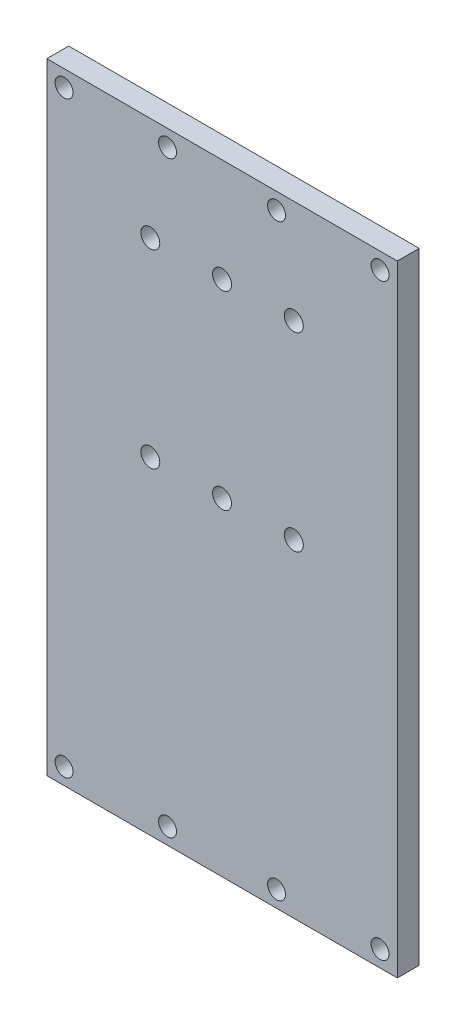
ISO-10303-21;
HEADER;
FILE_DESCRIPTION(('STEP AP214'),'2;1');
FILE_NAME('part.step','',(''),(''),'','','');
FILE_SCHEMA(('AUTOMOTIVE_DESIGN { 1 0 10303 214 1 1 1 1 }'));
ENDSEC;
DATA;
#1=APPLICATION_CONTEXT('core data for automotive mechanical design processes');
#2=APPLICATION_PROTOCOL_DEFINITION('international standard','automotive_design',2000,#1);
#3=PRODUCT_CONTEXT('',#1,'mechanical');
#4=PRODUCT('Part','Part','',(#3));
#5=PRODUCT_RELATED_PRODUCT_CATEGORY('part','',(#4));
#6=PRODUCT_DEFINITION_FORMATION('','',#4);
#7=PRODUCT_DEFINITION_CONTEXT('part definition',#1,'design');
#8=PRODUCT_DEFINITION('design','',#6,#7);
#9=PRODUCT_DEFINITION_SHAPE('','',#8);
#10=(LENGTH_UNIT() NAMED_UNIT(*) SI_UNIT(.MILLI.,.METRE.));
#11=(NAMED_UNIT(*) PLANE_ANGLE_UNIT() SI_UNIT($,.RADIAN.));
#12=(NAMED_UNIT(*) SI_UNIT($,.STERADIAN.) SOLID_ANGLE_UNIT());
#13=UNCERTAINTY_MEASURE_WITH_UNIT(LENGTH_MEASURE(1.E-05),#10,'distance_accuracy_value','');
#14=(GEOMETRIC_REPRESENTATION_CONTEXT(3) GLOBAL_UNCERTAINTY_ASSIGNED_CONTEXT((#13)) GLOBAL_UNIT_ASSIGNED_CONTEXT((#10,
#11,#12)) REPRESENTATION_CONTEXT('',''));
#15=CARTESIAN_POINT('',(0.,0.,0.));
#16=DIRECTION('',(0.,0.,1.));
#17=DIRECTION('',(1.,0.,0.));
#18=AXIS2_PLACEMENT_3D('',#15,#16,#17);
#19=CARTESIAN_POINT('',(-50.8,90.,6.35));
#20=DIRECTION('',(1.,0.,0.));
#21=DIRECTION('',(0.,1.,0.));
#22=AXIS2_PLACEMENT_3D('',#19,#20,#21);
#23=PLANE('',#22);
#24=DIRECTION('',(0.,-1.,0.));
#25=VECTOR('',#24,1.);
#26=CARTESIAN_POINT('',(-50.8,90.,0.));
#27=LINE('',#26,#25);
#28=CARTESIAN_POINT('',(-50.8,90.,0.));
#29=VERTEX_POINT('',#28);
#30=CARTESIAN_POINT('',(-50.8,-90.,0.));
#31=VERTEX_POINT('',#30);
#32=EDGE_CURVE('E95',#29,#31,#27,.T.);
#33=ORIENTED_EDGE('',*,*,#32,.T.);
#34=DIRECTION('',(0.,0.,-1.));
#35=VECTOR('',#34,1.);
#36=CARTESIAN_POINT('',(-50.8,-90.,6.35));
#37=LINE('',#36,#35);
#38=CARTESIAN_POINT('',(-50.8,-90.,6.35));
#39=VERTEX_POINT('',#38);
#40=EDGE_CURVE('E11',#39,#31,#37,.T.);
#41=ORIENTED_EDGE('',*,*,#40,.F.);
#42=DIRECTION('',(0.,-1.,0.));
#43=VECTOR('',#42,1.);
#44=CARTESIAN_POINT('',(-50.8,90.,6.35));
#45=LINE('',#44,#43);
#46=CARTESIAN_POINT('',(-50.8,90.,6.35));
#47=VERTEX_POINT('',#46);
#48=EDGE_CURVE('E83',#47,#39,#45,.T.);
#49=ORIENTED_EDGE('',*,*,#48,.F.);
#50=DIRECTION('',(0.,0.,-1.));
#51=VECTOR('',#50,1.);
#52=CARTESIAN_POINT('',(-50.8,90.,6.35));
#53=LINE('',#52,#51);
#54=EDGE_CURVE('E91',#47,#29,#53,.T.);
#55=ORIENTED_EDGE('',*,*,#54,.T.);
#56=EDGE_LOOP('',(#33,#41,#49,#55));
#57=FACE_BOUND('',#56,.T.);
#58=ADVANCED_FACE('F32',(#57),#23,.F.);
#59=CARTESIAN_POINT('',(-50.8,-90.,6.35));
#60=DIRECTION('',(0.,1.,0.));
#61=DIRECTION('',(0.,0.,1.));
#62=AXIS2_PLACEMENT_3D('',#59,#60,#61);
#63=PLANE('',#62);
#64=DIRECTION('',(1.,0.,0.));
#65=VECTOR('',#64,1.);
#66=CARTESIAN_POINT('',(-50.8,-90.,0.));
#67=LINE('',#66,#65);
#68=CARTESIAN_POINT('',(50.8,-90.,0.));
#69=VERTEX_POINT('',#68);
#70=EDGE_CURVE('E87',#31,#69,#67,.T.);
#71=ORIENTED_EDGE('',*,*,#70,.T.);
#72=DIRECTION('',(0.,0.,-1.));
#73=VECTOR('',#72,1.);
#74=CARTESIAN_POINT('',(50.8,-90.,6.35));
#75=LINE('',#74,#73);
#76=CARTESIAN_POINT('',(50.8,-90.,6.35));
#77=VERTEX_POINT('',#76);
#78=EDGE_CURVE('E40',#77,#69,#75,.T.);
#79=ORIENTED_EDGE('',*,*,#78,.F.);
#80=DIRECTION('',(1.,0.,0.));
#81=VECTOR('',#80,1.);
#82=CARTESIAN_POINT('',(-50.8,-90.,6.35));
#83=LINE('',#82,#81);
#84=EDGE_CURVE('E78',#39,#77,#83,.T.);
#85=ORIENTED_EDGE('',*,*,#84,.F.);
#86=ORIENTED_EDGE('',*,*,#40,.T.);
#87=EDGE_LOOP('',(#71,#79,#85,#86));
#88=FACE_BOUND('',#87,.T.);
#89=ADVANCED_FACE('F86',(#88),#63,.F.);
#90=CARTESIAN_POINT('',(50.8,90.,6.35));
#91=DIRECTION('',(-1.,0.,0.));
#92=DIRECTION('',(0.,-1.,0.));
#93=AXIS2_PLACEMENT_3D('',#90,#91,#92);
#94=PLANE('',#93);
#95=DIRECTION('',(0.,1.,0.));
#96=VECTOR('',#95,1.);
#97=CARTESIAN_POINT('',(50.8,90.,0.));
#98=LINE('',#97,#96);
#99=CARTESIAN_POINT('',(50.8,90.,0.));
#100=VERTEX_POINT('',#99);
#101=EDGE_CURVE('E65',#69,#100,#98,.T.);
#102=ORIENTED_EDGE('',*,*,#101,.T.);
#103=DIRECTION('',(0.,0.,-1.));
#104=VECTOR('',#103,1.);
#105=CARTESIAN_POINT('',(50.8,90.,6.35));
#106=LINE('',#105,#104);
#107=CARTESIAN_POINT('',(50.8,90.,6.35));
#108=VERTEX_POINT('',#107);
#109=EDGE_CURVE('E88',#108,#100,#106,.T.);
#110=ORIENTED_EDGE('',*,*,#109,.F.);
#111=DIRECTION('',(0.,1.,0.));
#112=VECTOR('',#111,1.);
#113=CARTESIAN_POINT('',(50.8,90.,6.35));
#114=LINE('',#113,#112);
#115=EDGE_CURVE('E81',#77,#108,#114,.T.);
#116=ORIENTED_EDGE('',*,*,#115,.F.);
#117=ORIENTED_EDGE('',*,*,#78,.T.);
#118=EDGE_LOOP('',(#102,#110,#116,#117));
#119=FACE_BOUND('',#118,.T.);
#120=ADVANCED_FACE('F89',(#119),#94,.F.);
#121=CARTESIAN_POINT('',(-50.8,90.,6.35));
#122=DIRECTION('',(0.,-1.,0.));
#123=DIRECTION('',(0.,0.,-1.));
#124=AXIS2_PLACEMENT_3D('',#121,#122,#123);
#125=PLANE('',#124);
#126=DIRECTION('',(-1.,0.,0.));
#127=VECTOR('',#126,1.);
#128=CARTESIAN_POINT('',(-50.8,90.,0.));
#129=LINE('',#128,#127);
#130=EDGE_CURVE('E71',#100,#29,#129,.T.);
#131=ORIENTED_EDGE('',*,*,#130,.T.);
#132=ORIENTED_EDGE('',*,*,#54,.F.);
#133=DIRECTION('',(-1.,0.,0.));
#134=VECTOR('',#133,1.);
#135=CARTESIAN_POINT('',(-50.8,90.,6.35));
#136=LINE('',#135,#134);
#137=EDGE_CURVE('E48',#108,#47,#136,.T.);
#138=ORIENTED_EDGE('',*,*,#137,.F.);
#139=ORIENTED_EDGE('',*,*,#109,.T.);
#140=EDGE_LOOP('',(#131,#132,#138,#139));
#141=FACE_BOUND('',#140,.T.);
#142=ADVANCED_FACE('F103',(#141),#125,.F.);
#143=CARTESIAN_POINT('',(-50.8,-90.,6.35));
#144=DIRECTION('',(0.,0.,1.));
#145=DIRECTION('',(1.,0.,0.));
#146=AXIS2_PLACEMENT_3D('',#143,#144,#145);
#147=PLANE('',#146);
#148=CARTESIAN_POINT('',(-20.8,5.00000000000001,6.35));
#149=DIRECTION('',(0.,0.,1.));
#150=DIRECTION('',(1.,0.,0.));
#151=AXIS2_PLACEMENT_3D('',#148,#149,#150);
#152=CIRCLE('',#151,2.74999999999996);
#153=CARTESIAN_POINT('',(-18.05,5.00000000000001,6.35));
#154=VERTEX_POINT('',#153);
#155=EDGE_CURVE('E189',#154,#154,#152,.T.);
#156=ORIENTED_EDGE('',*,*,#155,.F.);
#157=EDGE_LOOP('',(#156));
#158=FACE_BOUND('',#157,.T.);
#159=CARTESIAN_POINT('',(0.,5.00000000000001,6.35));
#160=DIRECTION('',(0.,0.,1.));
#161=DIRECTION('',(-1.,0.,0.));
#162=AXIS2_PLACEMENT_3D('',#159,#160,#161);
#163=CIRCLE('',#162,2.75);
#164=CARTESIAN_POINT('',(-2.74999999999997,5.00000000000001,6.35));
#165=VERTEX_POINT('',#164);
#166=EDGE_CURVE('E183',#165,#165,#163,.T.);
#167=ORIENTED_EDGE('',*,*,#166,.F.);
#168=EDGE_LOOP('',(#167));
#169=FACE_BOUND('',#168,.T.);
#170=CARTESIAN_POINT('',(20.8,5.00000000000001,6.35));
#171=DIRECTION('',(0.,0.,1.));
#172=DIRECTION('',(-1.,0.,0.));
#173=AXIS2_PLACEMENT_3D('',#170,#171,#172);
#174=CIRCLE('',#173,2.75);
#175=CARTESIAN_POINT('',(18.05,5.00000000000001,6.35));
#176=VERTEX_POINT('',#175);
#177=EDGE_CURVE('E177',#176,#176,#174,.T.);
#178=ORIENTED_EDGE('',*,*,#177,.F.);
#179=EDGE_LOOP('',(#178));
#180=FACE_BOUND('',#179,.T.);
#181=CARTESIAN_POINT('',(-20.8,60.,6.35));
#182=DIRECTION('',(0.,0.,1.));
#183=DIRECTION('',(-1.,0.,0.));
#184=AXIS2_PLACEMENT_3D('',#181,#182,#183);
#185=CIRCLE('',#184,2.74999999999998);
#186=CARTESIAN_POINT('',(-23.55,60.,6.35));
#187=VERTEX_POINT('',#186);
#188=EDGE_CURVE('E171',#187,#187,#185,.T.);
#189=ORIENTED_EDGE('',*,*,#188,.F.);
#190=EDGE_LOOP('',(#189));
#191=FACE_BOUND('',#190,.T.);
#192=CARTESIAN_POINT('',(0.,60.,6.35));
#193=DIRECTION('',(0.,0.,1.));
#194=DIRECTION('',(1.,0.,0.));
#195=AXIS2_PLACEMENT_3D('',#192,#193,#194);
#196=CIRCLE('',#195,2.75);
#197=CARTESIAN_POINT('',(2.75000000000001,60.,6.35));
#198=VERTEX_POINT('',#197);
#199=EDGE_CURVE('E165',#198,#198,#196,.T.);
#200=ORIENTED_EDGE('',*,*,#199,.F.);
#201=EDGE_LOOP('',(#200));
#202=FACE_BOUND('',#201,.T.);
#203=CARTESIAN_POINT('',(20.8,60.,6.35));
#204=DIRECTION('',(0.,0.,1.));
#205=DIRECTION('',(1.,0.,0.));
#206=AXIS2_PLACEMENT_3D('',#203,#204,#205);
#207=CIRCLE('',#206,2.75);
#208=CARTESIAN_POINT('',(23.55,60.,6.35));
#209=VERTEX_POINT('',#208);
#210=EDGE_CURVE('E159',#209,#209,#207,.T.);
#211=ORIENTED_EDGE('',*,*,#210,.F.);
#212=EDGE_LOOP('',(#211));
#213=FACE_BOUND('',#212,.T.);
#214=CARTESIAN_POINT('',(-45.7999999999999,-85.24,6.35));
#215=DIRECTION('',(0.,0.,1.));
#216=DIRECTION('',(-1.,0.,0.));
#217=AXIS2_PLACEMENT_3D('',#214,#215,#216);
#218=CIRCLE('',#217,2.6);
#219=CARTESIAN_POINT('',(-48.3999999999999,-85.24,6.35));
#220=VERTEX_POINT('',#219);
#221=EDGE_CURVE('E153',#220,#220,#218,.T.);
#222=ORIENTED_EDGE('',*,*,#221,.F.);
#223=EDGE_LOOP('',(#222));
#224=FACE_BOUND('',#223,.T.);
#225=CARTESIAN_POINT('',(-15.7999999999999,-85.24,6.35));
#226=DIRECTION('',(0.,0.,1.));
#227=DIRECTION('',(-1.,0.,0.));
#228=AXIS2_PLACEMENT_3D('',#225,#226,#227);
#229=CIRCLE('',#228,2.6);
#230=CARTESIAN_POINT('',(-18.3999999999999,-85.24,6.35));
#231=VERTEX_POINT('',#230);
#232=EDGE_CURVE('E147',#231,#231,#229,.T.);
#233=ORIENTED_EDGE('',*,*,#232,.F.);
#234=EDGE_LOOP('',(#233));
#235=FACE_BOUND('',#234,.T.);
#236=CARTESIAN_POINT('',(15.8,-85.24,6.35));
#237=DIRECTION('',(0.,0.,1.));
#238=DIRECTION('',(1.,0.,0.));
#239=AXIS2_PLACEMENT_3D('',#236,#237,#238);
#240=CIRCLE('',#239,2.6);
#241=CARTESIAN_POINT('',(18.4,-85.24,6.35));
#242=VERTEX_POINT('',#241);
#243=EDGE_CURVE('E141',#242,#242,#240,.T.);
#244=ORIENTED_EDGE('',*,*,#243,.F.);
#245=EDGE_LOOP('',(#244));
#246=FACE_BOUND('',#245,.T.);
#247=CARTESIAN_POINT('',(45.8,-85.24,6.35));
#248=DIRECTION('',(0.,0.,1.));
#249=DIRECTION('',(1.,0.,0.));
#250=AXIS2_PLACEMENT_3D('',#247,#248,#249);
#251=CIRCLE('',#250,2.6);
#252=CARTESIAN_POINT('',(48.4,-85.24,6.35));
#253=VERTEX_POINT('',#252);
#254=EDGE_CURVE('E135',#253,#253,#251,.T.);
#255=ORIENTED_EDGE('',*,*,#254,.F.);
#256=EDGE_LOOP('',(#255));
#257=FACE_BOUND('',#256,.T.);
#258=CARTESIAN_POINT('',(45.8,85.24,6.35));
#259=DIRECTION('',(0.,0.,1.));
#260=DIRECTION('',(-1.,0.,0.));
#261=AXIS2_PLACEMENT_3D('',#258,#259,#260);
#262=CIRCLE('',#261,2.6);
#263=CARTESIAN_POINT('',(43.2,85.24,6.35));
#264=VERTEX_POINT('',#263);
#265=EDGE_CURVE('E129',#264,#264,#262,.T.);
#266=ORIENTED_EDGE('',*,*,#265,.F.);
#267=EDGE_LOOP('',(#266));
#268=FACE_BOUND('',#267,.T.);
#269=CARTESIAN_POINT('',(15.8,85.24,6.35));
#270=DIRECTION('',(0.,0.,1.));
#271=DIRECTION('',(-1.,0.,0.));
#272=AXIS2_PLACEMENT_3D('',#269,#270,#271);
#273=CIRCLE('',#272,2.6);
#274=CARTESIAN_POINT('',(13.2,85.24,6.35));
#275=VERTEX_POINT('',#274);
#276=EDGE_CURVE('E123',#275,#275,#273,.T.);
#277=ORIENTED_EDGE('',*,*,#276,.F.);
#278=EDGE_LOOP('',(#277));
#279=FACE_BOUND('',#278,.T.);
#280=CARTESIAN_POINT('',(-15.8,85.24,6.35));
#281=DIRECTION('',(0.,0.,1.));
#282=DIRECTION('',(1.,0.,0.));
#283=AXIS2_PLACEMENT_3D('',#280,#281,#282);
#284=CIRCLE('',#283,2.6);
#285=CARTESIAN_POINT('',(-13.2,85.24,6.35));
#286=VERTEX_POINT('',#285);
#287=EDGE_CURVE('E117',#286,#286,#284,.T.);
#288=ORIENTED_EDGE('',*,*,#287,.F.);
#289=EDGE_LOOP('',(#288));
#290=FACE_BOUND('',#289,.T.);
#291=CARTESIAN_POINT('',(-45.8,85.24,6.35));
#292=DIRECTION('',(0.,0.,1.));
#293=DIRECTION('',(1.,0.,0.));
#294=AXIS2_PLACEMENT_3D('',#291,#292,#293);
#295=CIRCLE('',#294,2.6);
#296=CARTESIAN_POINT('',(-43.2,85.24,6.35));
#297=VERTEX_POINT('',#296);
#298=EDGE_CURVE('E111',#297,#297,#295,.T.);
#299=ORIENTED_EDGE('',*,*,#298,.F.);
#300=EDGE_LOOP('',(#299));
#301=FACE_BOUND('',#300,.T.);
#302=ORIENTED_EDGE('',*,*,#48,.T.);
#303=ORIENTED_EDGE('',*,*,#84,.T.);
#304=ORIENTED_EDGE('',*,*,#115,.T.);
#305=ORIENTED_EDGE('',*,*,#137,.T.);
#306=EDGE_LOOP('',(#302,#303,#304,#305));
#307=FACE_BOUND('',#306,.T.);
#308=ADVANCED_FACE('F79',(#158,#169,#180,#191,#202,#213,#224,#235,#246,#257,#268,#279,#290,#301,
#307),#147,.T.);
#309=CARTESIAN_POINT('',(-50.8,-90.,0.));
#310=DIRECTION('',(0.,0.,1.));
#311=DIRECTION('',(1.,0.,0.));
#312=AXIS2_PLACEMENT_3D('',#309,#310,#311);
#313=PLANE('',#312);
#314=CARTESIAN_POINT('',(-20.8,5.00000000000001,0.));
#315=DIRECTION('',(0.,0.,1.));
#316=DIRECTION('',(1.,0.,0.));
#317=AXIS2_PLACEMENT_3D('',#314,#315,#316);
#318=CIRCLE('',#317,2.74999999999996);
#319=CARTESIAN_POINT('',(-18.05,5.00000000000001,0.));
#320=VERTEX_POINT('',#319);
#321=EDGE_CURVE('E186',#320,#320,#318,.F.);
#322=ORIENTED_EDGE('',*,*,#321,.F.);
#323=EDGE_LOOP('',(#322));
#324=FACE_BOUND('',#323,.T.);
#325=CARTESIAN_POINT('',(0.,5.00000000000001,0.));
#326=DIRECTION('',(0.,0.,1.));
#327=DIRECTION('',(1.,0.,0.));
#328=AXIS2_PLACEMENT_3D('',#325,#326,#327);
#329=CIRCLE('',#328,2.75);
#330=CARTESIAN_POINT('',(2.75000000000003,5.00000000000001,0.));
#331=VERTEX_POINT('',#330);
#332=EDGE_CURVE('E180',#331,#331,#329,.F.);
#333=ORIENTED_EDGE('',*,*,#332,.F.);
#334=EDGE_LOOP('',(#333));
#335=FACE_BOUND('',#334,.T.);
#336=CARTESIAN_POINT('',(20.8,5.00000000000001,0.));
#337=DIRECTION('',(0.,0.,1.));
#338=DIRECTION('',(1.,0.,0.));
#339=AXIS2_PLACEMENT_3D('',#336,#337,#338);
#340=CIRCLE('',#339,2.75);
#341=CARTESIAN_POINT('',(23.55,5.00000000000001,0.));
#342=VERTEX_POINT('',#341);
#343=EDGE_CURVE('E174',#342,#342,#340,.F.);
#344=ORIENTED_EDGE('',*,*,#343,.F.);
#345=EDGE_LOOP('',(#344));
#346=FACE_BOUND('',#345,.T.);
#347=CARTESIAN_POINT('',(-20.8,60.,0.));
#348=DIRECTION('',(0.,0.,1.));
#349=DIRECTION('',(1.,0.,0.));
#350=AXIS2_PLACEMENT_3D('',#347,#348,#349);
#351=CIRCLE('',#350,2.74999999999998);
#352=CARTESIAN_POINT('',(-18.05,60.,0.));
#353=VERTEX_POINT('',#352);
#354=EDGE_CURVE('E168',#353,#353,#351,.F.);
#355=ORIENTED_EDGE('',*,*,#354,.F.);
#356=EDGE_LOOP('',(#355));
#357=FACE_BOUND('',#356,.T.);
#358=CARTESIAN_POINT('',(0.,60.,0.));
#359=DIRECTION('',(0.,0.,1.));
#360=DIRECTION('',(1.,0.,0.));
#361=AXIS2_PLACEMENT_3D('',#358,#359,#360);
#362=CIRCLE('',#361,2.75);
#363=CARTESIAN_POINT('',(2.75000000000001,60.,0.));
#364=VERTEX_POINT('',#363);
#365=EDGE_CURVE('E162',#364,#364,#362,.F.);
#366=ORIENTED_EDGE('',*,*,#365,.F.);
#367=EDGE_LOOP('',(#366));
#368=FACE_BOUND('',#367,.T.);
#369=CARTESIAN_POINT('',(20.8,60.,0.));
#370=DIRECTION('',(0.,0.,1.));
#371=DIRECTION('',(1.,0.,0.));
#372=AXIS2_PLACEMENT_3D('',#369,#370,#371);
#373=CIRCLE('',#372,2.75);
#374=CARTESIAN_POINT('',(23.55,60.,0.));
#375=VERTEX_POINT('',#374);
#376=EDGE_CURVE('E156',#375,#375,#373,.F.);
#377=ORIENTED_EDGE('',*,*,#376,.F.);
#378=EDGE_LOOP('',(#377));
#379=FACE_BOUND('',#378,.T.);
#380=CARTESIAN_POINT('',(-45.7999999999999,-85.24,0.));
#381=DIRECTION('',(0.,0.,1.));
#382=DIRECTION('',(1.,0.,0.));
#383=AXIS2_PLACEMENT_3D('',#380,#381,#382);
#384=CIRCLE('',#383,2.6);
#385=CARTESIAN_POINT('',(-43.1999999999999,-85.24,0.));
#386=VERTEX_POINT('',#385);
#387=EDGE_CURVE('E150',#386,#386,#384,.F.);
#388=ORIENTED_EDGE('',*,*,#387,.F.);
#389=EDGE_LOOP('',(#388));
#390=FACE_BOUND('',#389,.T.);
#391=CARTESIAN_POINT('',(-15.7999999999999,-85.24,0.));
#392=DIRECTION('',(0.,0.,1.));
#393=DIRECTION('',(1.,0.,0.));
#394=AXIS2_PLACEMENT_3D('',#391,#392,#393);
#395=CIRCLE('',#394,2.6);
#396=CARTESIAN_POINT('',(-13.1999999999999,-85.24,0.));
#397=VERTEX_POINT('',#396);
#398=EDGE_CURVE('E144',#397,#397,#395,.F.);
#399=ORIENTED_EDGE('',*,*,#398,.F.);
#400=EDGE_LOOP('',(#399));
#401=FACE_BOUND('',#400,.T.);
#402=CARTESIAN_POINT('',(15.8,-85.24,0.));
#403=DIRECTION('',(0.,0.,1.));
#404=DIRECTION('',(1.,0.,0.));
#405=AXIS2_PLACEMENT_3D('',#402,#403,#404);
#406=CIRCLE('',#405,2.6);
#407=CARTESIAN_POINT('',(18.4,-85.24,0.));
#408=VERTEX_POINT('',#407);
#409=EDGE_CURVE('E138',#408,#408,#406,.F.);
#410=ORIENTED_EDGE('',*,*,#409,.F.);
#411=EDGE_LOOP('',(#410));
#412=FACE_BOUND('',#411,.T.);
#413=CARTESIAN_POINT('',(45.8,-85.24,0.));
#414=DIRECTION('',(0.,0.,1.));
#415=DIRECTION('',(1.,0.,0.));
#416=AXIS2_PLACEMENT_3D('',#413,#414,#415);
#417=CIRCLE('',#416,2.6);
#418=CARTESIAN_POINT('',(48.4,-85.24,0.));
#419=VERTEX_POINT('',#418);
#420=EDGE_CURVE('E132',#419,#419,#417,.F.);
#421=ORIENTED_EDGE('',*,*,#420,.F.);
#422=EDGE_LOOP('',(#421));
#423=FACE_BOUND('',#422,.T.);
#424=CARTESIAN_POINT('',(45.8,85.24,0.));
#425=DIRECTION('',(0.,0.,1.));
#426=DIRECTION('',(1.,0.,0.));
#427=AXIS2_PLACEMENT_3D('',#424,#425,#426);
#428=CIRCLE('',#427,2.6);
#429=CARTESIAN_POINT('',(48.4,85.24,0.));
#430=VERTEX_POINT('',#429);
#431=EDGE_CURVE('E126',#430,#430,#428,.F.);
#432=ORIENTED_EDGE('',*,*,#431,.F.);
#433=EDGE_LOOP('',(#432));
#434=FACE_BOUND('',#433,.T.);
#435=CARTESIAN_POINT('',(15.8,85.24,0.));
#436=DIRECTION('',(0.,0.,1.));
#437=DIRECTION('',(1.,0.,0.));
#438=AXIS2_PLACEMENT_3D('',#435,#436,#437);
#439=CIRCLE('',#438,2.6);
#440=CARTESIAN_POINT('',(18.4,85.24,0.));
#441=VERTEX_POINT('',#440);
#442=EDGE_CURVE('E120',#441,#441,#439,.F.);
#443=ORIENTED_EDGE('',*,*,#442,.F.);
#444=EDGE_LOOP('',(#443));
#445=FACE_BOUND('',#444,.T.);
#446=CARTESIAN_POINT('',(-15.8,85.24,0.));
#447=DIRECTION('',(0.,0.,1.));
#448=DIRECTION('',(1.,0.,0.));
#449=AXIS2_PLACEMENT_3D('',#446,#447,#448);
#450=CIRCLE('',#449,2.6);
#451=CARTESIAN_POINT('',(-13.2,85.24,0.));
#452=VERTEX_POINT('',#451);
#453=EDGE_CURVE('E114',#452,#452,#450,.F.);
#454=ORIENTED_EDGE('',*,*,#453,.F.);
#455=EDGE_LOOP('',(#454));
#456=FACE_BOUND('',#455,.T.);
#457=CARTESIAN_POINT('',(-45.8,85.24,0.));
#458=DIRECTION('',(0.,0.,1.));
#459=DIRECTION('',(1.,0.,0.));
#460=AXIS2_PLACEMENT_3D('',#457,#458,#459);
#461=CIRCLE('',#460,2.6);
#462=CARTESIAN_POINT('',(-43.2,85.24,0.));
#463=VERTEX_POINT('',#462);
#464=EDGE_CURVE('E98',#463,#463,#461,.F.);
#465=ORIENTED_EDGE('',*,*,#464,.F.);
#466=EDGE_LOOP('',(#465));
#467=FACE_BOUND('',#466,.T.);
#468=ORIENTED_EDGE('',*,*,#32,.F.);
#469=ORIENTED_EDGE('',*,*,#130,.F.);
#470=ORIENTED_EDGE('',*,*,#101,.F.);
#471=ORIENTED_EDGE('',*,*,#70,.F.);
#472=EDGE_LOOP('',(#468,#469,#470,#471));
#473=FACE_BOUND('',#472,.T.);
#474=ADVANCED_FACE('F106',(#324,#335,#346,#357,#368,#379,#390,#401,#412,#423,#434,#445,#456,
#467,#473),#313,.F.);
#475=CARTESIAN_POINT('',(-45.8,85.24,-0.00100000000000013));
#476=DIRECTION('',(0.,0.,1.));
#477=DIRECTION('',(1.,0.,0.));
#478=AXIS2_PLACEMENT_3D('',#475,#476,#477);
#479=CYLINDRICAL_SURFACE('',#478,2.6);
#480=ORIENTED_EDGE('',*,*,#298,.T.);
#481=EDGE_LOOP('',(#480));
#482=FACE_BOUND('',#481,.T.);
#483=ORIENTED_EDGE('',*,*,#464,.T.);
#484=EDGE_LOOP('',(#483));
#485=FACE_BOUND('',#484,.T.);
#486=ADVANCED_FACE('F225',(#482,#485),#479,.F.);
#487=CARTESIAN_POINT('',(-15.8,85.24,-0.00100000000000013));
#488=DIRECTION('',(0.,0.,1.));
#489=DIRECTION('',(1.,0.,0.));
#490=AXIS2_PLACEMENT_3D('',#487,#488,#489);
#491=CYLINDRICAL_SURFACE('',#490,2.6);
#492=ORIENTED_EDGE('',*,*,#287,.T.);
#493=EDGE_LOOP('',(#492));
#494=FACE_BOUND('',#493,.T.);
#495=ORIENTED_EDGE('',*,*,#453,.T.);
#496=EDGE_LOOP('',(#495));
#497=FACE_BOUND('',#496,.T.);
#498=ADVANCED_FACE('F228',(#494,#497),#491,.F.);
#499=CARTESIAN_POINT('',(15.8,85.24,-0.00100000000000013));
#500=DIRECTION('',(0.,0.,1.));
#501=DIRECTION('',(1.,0.,0.));
#502=AXIS2_PLACEMENT_3D('',#499,#500,#501);
#503=CYLINDRICAL_SURFACE('',#502,2.6);
#504=ORIENTED_EDGE('',*,*,#276,.T.);
#505=EDGE_LOOP('',(#504));
#506=FACE_BOUND('',#505,.T.);
#507=ORIENTED_EDGE('',*,*,#442,.T.);
#508=EDGE_LOOP('',(#507));
#509=FACE_BOUND('',#508,.T.);
#510=ADVANCED_FACE('F276',(#506,#509),#503,.F.);
#511=CARTESIAN_POINT('',(45.8,85.24,-0.00100000000000013));
#512=DIRECTION('',(0.,0.,1.));
#513=DIRECTION('',(1.,0.,0.));
#514=AXIS2_PLACEMENT_3D('',#511,#512,#513);
#515=CYLINDRICAL_SURFACE('',#514,2.6);
#516=ORIENTED_EDGE('',*,*,#265,.T.);
#517=EDGE_LOOP('',(#516));
#518=FACE_BOUND('',#517,.T.);
#519=ORIENTED_EDGE('',*,*,#431,.T.);
#520=EDGE_LOOP('',(#519));
#521=FACE_BOUND('',#520,.T.);
#522=ADVANCED_FACE('F286',(#518,#521),#515,.F.);
#523=CARTESIAN_POINT('',(45.8,-85.24,-0.00100000000000013));
#524=DIRECTION('',(0.,0.,1.));
#525=DIRECTION('',(1.,0.,0.));
#526=AXIS2_PLACEMENT_3D('',#523,#524,#525);
#527=CYLINDRICAL_SURFACE('',#526,2.6);
#528=ORIENTED_EDGE('',*,*,#254,.T.);
#529=EDGE_LOOP('',(#528));
#530=FACE_BOUND('',#529,.T.);
#531=ORIENTED_EDGE('',*,*,#420,.T.);
#532=EDGE_LOOP('',(#531));
#533=FACE_BOUND('',#532,.T.);
#534=ADVANCED_FACE('F296',(#530,#533),#527,.F.);
#535=CARTESIAN_POINT('',(15.8,-85.24,-0.00100000000000013));
#536=DIRECTION('',(0.,0.,1.));
#537=DIRECTION('',(1.,0.,0.));
#538=AXIS2_PLACEMENT_3D('',#535,#536,#537);
#539=CYLINDRICAL_SURFACE('',#538,2.6);
#540=ORIENTED_EDGE('',*,*,#243,.T.);
#541=EDGE_LOOP('',(#540));
#542=FACE_BOUND('',#541,.T.);
#543=ORIENTED_EDGE('',*,*,#409,.T.);
#544=EDGE_LOOP('',(#543));
#545=FACE_BOUND('',#544,.T.);
#546=ADVANCED_FACE('F306',(#542,#545),#539,.F.);
#547=CARTESIAN_POINT('',(-15.7999999999999,-85.24,-0.00100000000000013));
#548=DIRECTION('',(0.,0.,1.));
#549=DIRECTION('',(1.,0.,0.));
#550=AXIS2_PLACEMENT_3D('',#547,#548,#549);
#551=CYLINDRICAL_SURFACE('',#550,2.6);
#552=ORIENTED_EDGE('',*,*,#232,.T.);
#553=EDGE_LOOP('',(#552));
#554=FACE_BOUND('',#553,.T.);
#555=ORIENTED_EDGE('',*,*,#398,.T.);
#556=EDGE_LOOP('',(#555));
#557=FACE_BOUND('',#556,.T.);
#558=ADVANCED_FACE('F316',(#554,#557),#551,.F.);
#559=CARTESIAN_POINT('',(-45.7999999999999,-85.24,-0.00100000000000013));
#560=DIRECTION('',(0.,0.,1.));
#561=DIRECTION('',(1.,0.,0.));
#562=AXIS2_PLACEMENT_3D('',#559,#560,#561);
#563=CYLINDRICAL_SURFACE('',#562,2.6);
#564=ORIENTED_EDGE('',*,*,#221,.T.);
#565=EDGE_LOOP('',(#564));
#566=FACE_BOUND('',#565,.T.);
#567=ORIENTED_EDGE('',*,*,#387,.T.);
#568=EDGE_LOOP('',(#567));
#569=FACE_BOUND('',#568,.T.);
#570=ADVANCED_FACE('F326',(#566,#569),#563,.F.);
#571=CARTESIAN_POINT('',(20.8,60.,-0.00100000000000013));
#572=DIRECTION('',(0.,0.,1.));
#573=DIRECTION('',(1.,0.,0.));
#574=AXIS2_PLACEMENT_3D('',#571,#572,#573);
#575=CYLINDRICAL_SURFACE('',#574,2.75);
#576=ORIENTED_EDGE('',*,*,#210,.T.);
#577=EDGE_LOOP('',(#576));
#578=FACE_BOUND('',#577,.T.);
#579=ORIENTED_EDGE('',*,*,#376,.T.);
#580=EDGE_LOOP('',(#579));
#581=FACE_BOUND('',#580,.T.);
#582=ADVANCED_FACE('F336',(#578,#581),#575,.F.);
#583=CARTESIAN_POINT('',(0.,60.,-0.00100000000000013));
#584=DIRECTION('',(0.,0.,1.));
#585=DIRECTION('',(1.,0.,0.));
#586=AXIS2_PLACEMENT_3D('',#583,#584,#585);
#587=CYLINDRICAL_SURFACE('',#586,2.75);
#588=ORIENTED_EDGE('',*,*,#199,.T.);
#589=EDGE_LOOP('',(#588));
#590=FACE_BOUND('',#589,.T.);
#591=ORIENTED_EDGE('',*,*,#365,.T.);
#592=EDGE_LOOP('',(#591));
#593=FACE_BOUND('',#592,.T.);
#594=ADVANCED_FACE('F346',(#590,#593),#587,.F.);
#595=CARTESIAN_POINT('',(-20.8,60.,-0.00100000000000013));
#596=DIRECTION('',(0.,0.,1.));
#597=DIRECTION('',(1.,0.,0.));
#598=AXIS2_PLACEMENT_3D('',#595,#596,#597);
#599=CYLINDRICAL_SURFACE('',#598,2.74999999999998);
#600=ORIENTED_EDGE('',*,*,#188,.T.);
#601=EDGE_LOOP('',(#600));
#602=FACE_BOUND('',#601,.T.);
#603=ORIENTED_EDGE('',*,*,#354,.T.);
#604=EDGE_LOOP('',(#603));
#605=FACE_BOUND('',#604,.T.);
#606=ADVANCED_FACE('F356',(#602,#605),#599,.F.);
#607=CARTESIAN_POINT('',(20.8,5.00000000000001,-0.00100000000000013));
#608=DIRECTION('',(0.,0.,1.));
#609=DIRECTION('',(1.,0.,0.));
#610=AXIS2_PLACEMENT_3D('',#607,#608,#609);
#611=CYLINDRICAL_SURFACE('',#610,2.75);
#612=ORIENTED_EDGE('',*,*,#177,.T.);
#613=EDGE_LOOP('',(#612));
#614=FACE_BOUND('',#613,.T.);
#615=ORIENTED_EDGE('',*,*,#343,.T.);
#616=EDGE_LOOP('',(#615));
#617=FACE_BOUND('',#616,.T.);
#618=ADVANCED_FACE('F366',(#614,#617),#611,.F.);
#619=CARTESIAN_POINT('',(0.,5.00000000000001,-0.00100000000000013));
#620=DIRECTION('',(0.,0.,1.));
#621=DIRECTION('',(1.,0.,0.));
#622=AXIS2_PLACEMENT_3D('',#619,#620,#621);
#623=CYLINDRICAL_SURFACE('',#622,2.75);
#624=ORIENTED_EDGE('',*,*,#166,.T.);
#625=EDGE_LOOP('',(#624));
#626=FACE_BOUND('',#625,.T.);
#627=ORIENTED_EDGE('',*,*,#332,.T.);
#628=EDGE_LOOP('',(#627));
#629=FACE_BOUND('',#628,.T.);
#630=ADVANCED_FACE('F376',(#626,#629),#623,.F.);
#631=CARTESIAN_POINT('',(-20.8,5.00000000000001,-0.00100000000000013));
#632=DIRECTION('',(0.,0.,1.));
#633=DIRECTION('',(1.,0.,0.));
#634=AXIS2_PLACEMENT_3D('',#631,#632,#633);
#635=CYLINDRICAL_SURFACE('',#634,2.74999999999996);
#636=ORIENTED_EDGE('',*,*,#155,.T.);
#637=EDGE_LOOP('',(#636));
#638=FACE_BOUND('',#637,.T.);
#639=ORIENTED_EDGE('',*,*,#321,.T.);
#640=EDGE_LOOP('',(#639));
#641=FACE_BOUND('',#640,.T.);
#642=ADVANCED_FACE('F193',(#638,#641),#635,.F.);
#643=CLOSED_SHELL('',(#58,#89,#120,#142,#308,#474,#486,#498,#510,#522,#534,#546,#558,#570,#582,
#594,#606,#618,#630,#642));
#644=MANIFOLD_SOLID_BREP('B2',#643);
#645=ADVANCED_BREP_SHAPE_REPRESENTATION('',(#18,#644),#14);
#646=SHAPE_DEFINITION_REPRESENTATION(#9,#645);
ENDSEC;
END-ISO-10303-21;
